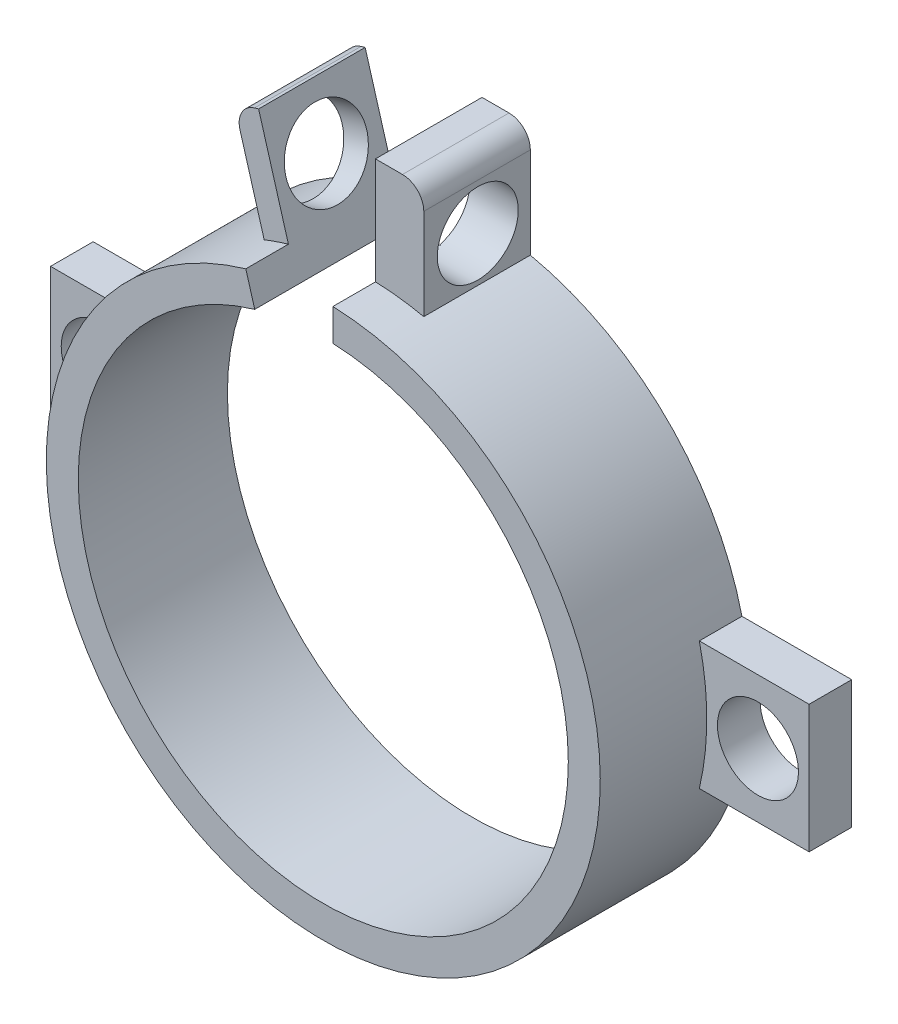
ISO-10303-21;
HEADER;
FILE_DESCRIPTION(('STEP AP214'),'2;1');
FILE_NAME('part.step','',(''),(''),'','','');
FILE_SCHEMA(('AUTOMOTIVE_DESIGN { 1 0 10303 214 1 1 1 1 }'));
ENDSEC;
DATA;
#1=APPLICATION_CONTEXT('core data for automotive mechanical design processes');
#2=APPLICATION_PROTOCOL_DEFINITION('international standard','automotive_design',2000,#1);
#3=PRODUCT_CONTEXT('',#1,'mechanical');
#4=PRODUCT('Part','Part','',(#3));
#5=PRODUCT_RELATED_PRODUCT_CATEGORY('part','',(#4));
#6=PRODUCT_DEFINITION_FORMATION('','',#4);
#7=PRODUCT_DEFINITION_CONTEXT('part definition',#1,'design');
#8=PRODUCT_DEFINITION('design','',#6,#7);
#9=PRODUCT_DEFINITION_SHAPE('','',#8);
#10=(LENGTH_UNIT() NAMED_UNIT(*) SI_UNIT(.MILLI.,.METRE.));
#11=(NAMED_UNIT(*) PLANE_ANGLE_UNIT() SI_UNIT($,.RADIAN.));
#12=(NAMED_UNIT(*) SI_UNIT($,.STERADIAN.) SOLID_ANGLE_UNIT());
#13=UNCERTAINTY_MEASURE_WITH_UNIT(LENGTH_MEASURE(1.E-05),#10,'distance_accuracy_value','');
#14=(GEOMETRIC_REPRESENTATION_CONTEXT(3) GLOBAL_UNCERTAINTY_ASSIGNED_CONTEXT((#13)) GLOBAL_UNIT_ASSIGNED_CONTEXT((#10,
#11,#12)) REPRESENTATION_CONTEXT('',''));
#15=CARTESIAN_POINT('',(0.,0.,0.));
#16=DIRECTION('',(0.,0.,1.));
#17=DIRECTION('',(1.,0.,0.));
#18=AXIS2_PLACEMENT_3D('',#15,#16,#17);
#19=CARTESIAN_POINT('',(0.,0.,-7.));
#20=DIRECTION('',(0.,0.,1.));
#21=DIRECTION('',(1.,0.,0.));
#22=AXIS2_PLACEMENT_3D('',#19,#20,#21);
#23=CYLINDRICAL_SURFACE('',#22,13.);
#24=CARTESIAN_POINT('',(0.,0.,-2.));
#25=DIRECTION('',(0.,0.,-1.));
#26=DIRECTION('',(-1.,0.,0.));
#27=AXIS2_PLACEMENT_3D('',#24,#25,#26);
#28=CIRCLE('',#27,13.);
#29=CARTESIAN_POINT('',(-4.77288630332188,12.0921278663254,-2.));
#30=VERTEX_POINT('',#29);
#31=CARTESIAN_POINT('',(-3.63631219376138,12.4810750189838,-2.));
#32=VERTEX_POINT('',#31);
#33=EDGE_CURVE('E71',#30,#32,#28,.T.);
#34=ORIENTED_EDGE('',*,*,#33,.F.);
#35=DIRECTION('',(0.,0.,-1.));
#36=VECTOR('',#35,1.);
#37=CARTESIAN_POINT('',(-4.77288630332188,12.0921278663254,-2.));
#38=LINE('',#37,#36);
#39=CARTESIAN_POINT('',(-4.77288630332188,12.0921278663254,-7.));
#40=VERTEX_POINT('',#39);
#41=EDGE_CURVE('E241',#30,#40,#38,.T.);
#42=ORIENTED_EDGE('',*,*,#41,.T.);
#43=CARTESIAN_POINT('',(0.,0.,-7.));
#44=DIRECTION('',(0.,0.,1.));
#45=DIRECTION('',(1.,0.,0.));
#46=AXIS2_PLACEMENT_3D('',#43,#44,#45);
#47=CIRCLE('',#46,13.);
#48=CARTESIAN_POINT('',(-12.6491106406735,2.99999999999991,-7.));
#49=VERTEX_POINT('',#48);
#50=EDGE_CURVE('E471',#40,#49,#47,.T.);
#51=ORIENTED_EDGE('',*,*,#50,.T.);
#52=DIRECTION('',(0.,0.,-1.));
#53=VECTOR('',#52,1.);
#54=CARTESIAN_POINT('',(-12.6491106406735,2.99999999999991,-5.));
#55=LINE('',#54,#53);
#56=CARTESIAN_POINT('',(-12.6491106406735,2.99999999999991,-5.));
#57=VERTEX_POINT('',#56);
#58=EDGE_CURVE('E450',#57,#49,#55,.T.);
#59=ORIENTED_EDGE('',*,*,#58,.F.);
#60=CARTESIAN_POINT('',(0.,0.,-5.));
#61=DIRECTION('',(0.,0.,-1.));
#62=DIRECTION('',(-1.,0.,0.));
#63=AXIS2_PLACEMENT_3D('',#60,#61,#62);
#64=CIRCLE('',#63,13.);
#65=CARTESIAN_POINT('',(-12.6491106406735,-3.00000000000009,-5.));
#66=VERTEX_POINT('',#65);
#67=EDGE_CURVE('E437',#66,#57,#64,.T.);
#68=ORIENTED_EDGE('',*,*,#67,.F.);
#69=DIRECTION('',(0.,0.,-1.));
#70=VECTOR('',#69,1.);
#71=CARTESIAN_POINT('',(-12.6491106406735,-3.00000000000009,-5.));
#72=LINE('',#71,#70);
#73=CARTESIAN_POINT('',(-12.6491106406735,-3.00000000000009,-7.));
#74=VERTEX_POINT('',#73);
#75=EDGE_CURVE('E466',#66,#74,#72,.T.);
#76=ORIENTED_EDGE('',*,*,#75,.T.);
#77=CARTESIAN_POINT('',(12.6491106406735,-3.,-7.));
#78=VERTEX_POINT('',#77);
#79=EDGE_CURVE('E474',#74,#78,#47,.T.);
#80=ORIENTED_EDGE('',*,*,#79,.T.);
#81=DIRECTION('',(0.,0.,-1.));
#82=VECTOR('',#81,1.);
#83=CARTESIAN_POINT('',(12.6491106406735,-3.,-5.));
#84=LINE('',#83,#82);
#85=CARTESIAN_POINT('',(12.6491106406735,-3.,-5.));
#86=VERTEX_POINT('',#85);
#87=EDGE_CURVE('E410',#86,#78,#84,.T.);
#88=ORIENTED_EDGE('',*,*,#87,.F.);
#89=CARTESIAN_POINT('',(0.,0.,-5.));
#90=DIRECTION('',(0.,0.,-1.));
#91=DIRECTION('',(-1.,0.,0.));
#92=AXIS2_PLACEMENT_3D('',#89,#90,#91);
#93=CIRCLE('',#92,13.);
#94=CARTESIAN_POINT('',(12.6491106406735,3.,-5.));
#95=VERTEX_POINT('',#94);
#96=EDGE_CURVE('E402',#95,#86,#93,.T.);
#97=ORIENTED_EDGE('',*,*,#96,.F.);
#98=DIRECTION('',(0.,0.,-1.));
#99=VECTOR('',#98,1.);
#100=CARTESIAN_POINT('',(12.6491106406735,3.,-5.));
#101=LINE('',#100,#99);
#102=CARTESIAN_POINT('',(12.6491106406735,3.,-7.));
#103=VERTEX_POINT('',#102);
#104=EDGE_CURVE('E429',#95,#103,#101,.T.);
#105=ORIENTED_EDGE('',*,*,#104,.T.);
#106=CARTESIAN_POINT('',(2.7175174746219,12.7127927213152,-7.));
#107=VERTEX_POINT('',#106);
#108=EDGE_CURVE('E545',#103,#107,#47,.T.);
#109=ORIENTED_EDGE('',*,*,#108,.T.);
#110=DIRECTION('',(0.,0.,-1.));
#111=VECTOR('',#110,1.);
#112=CARTESIAN_POINT('',(2.7175174746219,12.7127927213152,-2.));
#113=LINE('',#112,#111);
#114=CARTESIAN_POINT('',(2.7175174746219,12.7127927213152,-2.));
#115=VERTEX_POINT('',#114);
#116=EDGE_CURVE('E380',#115,#107,#113,.T.);
#117=ORIENTED_EDGE('',*,*,#116,.F.);
#118=CARTESIAN_POINT('',(0.,0.,-2.));
#119=DIRECTION('',(0.,0.,-1.));
#120=DIRECTION('',(-1.,0.,0.));
#121=AXIS2_PLACEMENT_3D('',#118,#119,#120);
#122=CIRCLE('',#121,13.);
#123=CARTESIAN_POINT('',(0.595067388336295,12.9863734276871,-2.));
#124=VERTEX_POINT('',#123);
#125=EDGE_CURVE('E589',#124,#115,#122,.T.);
#126=ORIENTED_EDGE('',*,*,#125,.F.);
#127=DIRECTION('',(0.,0.,-1.));
#128=VECTOR('',#127,1.);
#129=CARTESIAN_POINT('',(0.595067388336296,12.9863734276871,-2.));
#130=LINE('',#129,#128);
#131=CARTESIAN_POINT('',(0.595067388336296,12.9863734276871,-4.07773920789325));
#132=VERTEX_POINT('',#131);
#133=EDGE_CURVE('E379',#124,#132,#130,.T.);
#134=ORIENTED_EDGE('',*,*,#133,.T.);
#135=CARTESIAN_POINT('',(0.449573557955294,12.9922239672809,-4.05470401112014));
#136=CARTESIAN_POINT('',(0.488859370004037,12.9908652955899,-4.05993242301531));
#137=CARTESIAN_POINT('',(0.528050965217172,12.9893300069907,-4.06589927704823));
#138=CARTESIAN_POINT('',(0.606193702039485,12.9859176149584,-4.07952709326514));
#139=CARTESIAN_POINT('',(0.645144293468684,12.9840399097325,-4.08719104323699));
#140=CARTESIAN_POINT('',(0.722847449837045,12.9799466612317,-4.10446536918196));
#141=CARTESIAN_POINT('',(0.761597383909745,12.9777291394168,-4.11408726021047));
#142=CARTESIAN_POINT('',(0.838430293481071,12.9729916874695,-4.13557120541122));
#143=CARTESIAN_POINT('',(0.876513767982155,12.9704719957503,-4.14743149766109));
#144=CARTESIAN_POINT('',(0.949163938022189,12.9653508630974,-4.17299041123941));
#145=CARTESIAN_POINT('',(0.983794112806286,12.9627665202925,-4.18651009451632));
#146=CARTESIAN_POINT('',(1.05178900580302,12.9574264064672,-4.21655557337149));
#147=CARTESIAN_POINT('',(1.08515268545299,12.9546704994473,-4.23308377430113));
#148=CARTESIAN_POINT('',(1.1438562685919,12.9496062054699,-4.26678713589666));
#149=CARTESIAN_POINT('',(1.16956336438751,12.9473060224086,-4.2833168136377));
#150=CARTESIAN_POINT('',(1.21837393057572,12.9428032002544,-4.31985404596173));
#151=CARTESIAN_POINT('',(1.24148847591711,12.9406001727089,-4.33984579989901));
#152=CARTESIAN_POINT('',(1.2720598885534,12.9376182087695,-4.37270530455639));
#153=CARTESIAN_POINT('',(1.28137493859821,12.9366979203703,-4.38381719497882));
#154=CARTESIAN_POINT('',(1.29849740149479,12.9349904418109,-4.40718800859379));
#155=CARTESIAN_POINT('',(1.3063041941194,12.9342033064224,-4.41944740059989));
#156=CARTESIAN_POINT('',(1.31994020357078,12.9328189494738,-4.44529059986966));
#157=CARTESIAN_POINT('',(1.3257390342871,12.9322246539049,-4.45889106432313));
#158=CARTESIAN_POINT('',(1.33450025546858,12.9313235738463,-4.48697926869783));
#159=CARTESIAN_POINT('',(1.33747081807351,12.9310159610559,-4.5014643227841));
#160=CARTESIAN_POINT('',(1.33993662752472,12.9307606496406,-4.52864539108484));
#161=CARTESIAN_POINT('',(1.33986742856083,12.9307678431495,-4.5413016334258));
#162=CARTESIAN_POINT('',(1.33733098863737,12.9310304054296,-4.56637258567058));
#163=CARTESIAN_POINT('',(1.33486170960086,12.9312859851231,-4.57878708115058));
#164=CARTESIAN_POINT('',(1.32743283899102,12.9320507636919,-4.60429650191897));
#165=CARTESIAN_POINT('',(1.32223181741911,12.9325845019224,-4.61731879782247));
#166=CARTESIAN_POINT('',(1.30980817948185,12.9338486780719,-4.64234058813223));
#167=CARTESIAN_POINT('',(1.30258249248203,12.934579414697,-4.65433849258822));
#168=CARTESIAN_POINT('',(1.28202950466573,12.9366362589828,-4.68391008310571));
#169=CARTESIAN_POINT('',(1.2675903003093,12.9380622703417,-4.70069516005044));
#170=CARTESIAN_POINT('',(1.23643172744966,12.9410774701532,-4.73195525671972));
#171=CARTESIAN_POINT('',(1.21970623026688,12.9426670942591,-4.74642383240245));
#172=CARTESIAN_POINT('',(1.16724373629715,12.9475388819386,-4.78712305802338));
#173=CARTESIAN_POINT('',(1.12933703684351,12.9509119949392,-4.81050921917742));
#174=CARTESIAN_POINT('',(1.05070880384488,12.9575306541135,-4.85223435347826));
#175=CARTESIAN_POINT('',(1.00997034599407,12.9607752115905,-4.87053900199822));
#176=CARTESIAN_POINT('',(0.926368132662709,12.9670205603693,-4.90356611244339));
#177=CARTESIAN_POINT('',(0.883481953504802,12.9700170726806,-4.91823202746056));
#178=CARTESIAN_POINT('',(0.796716207657195,12.9756364005753,-4.94449717064017));
#179=CARTESIAN_POINT('',(0.75283534729615,12.9782586927993,-4.95609212297143));
#180=CARTESIAN_POINT('',(0.665858749093949,12.9830068601549,-4.97640666929917));
#181=CARTESIAN_POINT('',(0.622781916761244,12.98514578651,-4.98520543597086));
#182=CARTESIAN_POINT('',(0.536364002167003,12.9890025288228,-5.00068232700251));
#183=CARTESIAN_POINT('',(0.493024131466979,12.9907216130431,-5.0073668565834));
#184=CARTESIAN_POINT('',(0.449573557955295,12.9922239672809,-5.01315522713724));
#185=B_SPLINE_CURVE_WITH_KNOTS('',3,(#135,#136,#137,#138,#139,#140,#141,#142,#143,#144,#145,
#146,#147,#148,#149,#150,#151,#152,#153,#154,#155,#156,#157,#158,#159,#160,#161,#162,#163,#164,
#165,#166,#167,#168,#169,#170,#171,#172,#173,#174,#175,#176,#177,#178,#179,#180,#181,#182,#183,
#184),.UNSPECIFIED.,.F.,.F.,(4,2,2,2,2,2,2,2,2,2,2,2,2,2,2,2,2,2,2,2,2,2,2,2,4),(0.,
0.118974083112916,0.238159312879793,0.358066879836008,0.477880454131258,0.589578335914206,
0.701365917115455,0.793141868623215,0.884509499053711,0.928003252276417,0.97151485315211,
1.01565875174486,1.05967470813972,1.0974076264977,1.13517261455118,1.17704090274683,
1.21897303586617,1.28515762158955,1.35152323535834,1.48478409433956,1.61892433776473,
1.75503427159676,1.89133273246481,2.02333118261898,2.15492581691757),.UNSPECIFIED.);
#186=CARTESIAN_POINT('',(0.449573557955288,12.9922239672809,-4.0547040111201));
#187=VERTEX_POINT('',#186);
#188=EDGE_CURVE('E261',#187,#132,#185,.T.);
#189=ORIENTED_EDGE('',*,*,#188,.F.);
#190=DIRECTION('',(0.,0.,1.));
#191=VECTOR('',#190,1.);
#192=CARTESIAN_POINT('',(0.449573557955288,12.9922239672809,-7.));
#193=LINE('',#192,#191);
#194=CARTESIAN_POINT('',(0.449573557955288,12.9922239672809,0.));
#195=VERTEX_POINT('',#194);
#196=EDGE_CURVE('E483',#187,#195,#193,.T.);
#197=ORIENTED_EDGE('',*,*,#196,.T.);
#198=CARTESIAN_POINT('',(0.,0.,0.));
#199=DIRECTION('',(0.,0.,1.));
#200=DIRECTION('',(1.,0.,0.));
#201=AXIS2_PLACEMENT_3D('',#198,#199,#200);
#202=CIRCLE('',#201,13.);
#203=CARTESIAN_POINT('',(-3.63631219376138,12.4810750189838,0.));
#204=VERTEX_POINT('',#203);
#205=EDGE_CURVE('E463',#204,#195,#202,.T.);
#206=ORIENTED_EDGE('',*,*,#205,.F.);
#207=DIRECTION('',(0.,0.,1.));
#208=VECTOR('',#207,1.);
#209=CARTESIAN_POINT('',(-3.63631219376138,12.4810750189838,-7.));
#210=LINE('',#209,#208);
#211=EDGE_CURVE('E58',#32,#204,#210,.T.);
#212=ORIENTED_EDGE('',*,*,#211,.F.);
#213=EDGE_LOOP('',(#34,#42,#51,#59,#68,#76,#80,#88,#97,#105,#109,#117,#126,#134,#189,#197,#206,#212));
#214=FACE_BOUND('',#213,.T.);
#215=ADVANCED_FACE('F49',(#214),#23,.T.);
#216=CARTESIAN_POINT('',(0.595067388336296,12.9863734276871,-2.));
#217=DIRECTION('',(-0.0457744144874074,-0.99895180212978,0.));
#218=DIRECTION('',(0.99895180212978,-0.0457744144874074,0.));
#219=AXIS2_PLACEMENT_3D('',#216,#217,#218);
#220=PLANE('',#219);
#221=CARTESIAN_POINT('',(-39.6564159827522,14.8307948298338,-4.53392961912868));
#222=DIRECTION('',(-0.0457744144874074,-0.99895180212978,0.));
#223=DIRECTION('',(0.99895180212978,-0.0457744144874074,0.));
#224=AXIS2_PLACEMENT_3D('',#221,#222,#223);
#225=ELLIPSE('',#224,41.5079039519488,1.9);
#226=CARTESIAN_POINT('',(0.449573557955288,12.993040310797,-4.05158293078121));
#227=VERTEX_POINT('',#226);
#228=EDGE_CURVE('E252',#132,#227,#225,.T.);
#229=ORIENTED_EDGE('',*,*,#228,.F.);
#230=ORIENTED_EDGE('',*,*,#133,.F.);
#231=DIRECTION('',(-0.99895180212978,0.0457744144874074,0.));
#232=VECTOR('',#231,1.);
#233=CARTESIAN_POINT('',(0.595067388336296,12.9863734276871,-2.));
#234=LINE('',#233,#232);
#235=CARTESIAN_POINT('',(0.449573557955288,12.993040310797,-2.));
#236=VERTEX_POINT('',#235);
#237=EDGE_CURVE('E587',#124,#236,#234,.T.);
#238=ORIENTED_EDGE('',*,*,#237,.T.);
#239=DIRECTION('',(0.,0.,-1.));
#240=VECTOR('',#239,1.);
#241=CARTESIAN_POINT('',(0.449573557955288,12.993040310797,-2.));
#242=LINE('',#241,#240);
#243=EDGE_CURVE('E388',#236,#227,#242,.T.);
#244=ORIENTED_EDGE('',*,*,#243,.T.);
#245=EDGE_LOOP('',(#229,#230,#238,#244));
#246=FACE_BOUND('',#245,.T.);
#247=ADVANCED_FACE('F287',(#246),#220,.T.);
#248=CARTESIAN_POINT('',(0.595067388336296,12.9863734276871,-4.99012003036412));
#249=VERTEX_POINT('',#248);
#250=CARTESIAN_POINT('',(0.449573557955294,12.9922239672809,-5.01315522713723));
#251=VERTEX_POINT('',#250);
#252=EDGE_CURVE('E254',#249,#251,#185,.T.);
#253=ORIENTED_EDGE('',*,*,#252,.F.);
#254=CARTESIAN_POINT('',(0.595067388336296,12.9863734276871,-7.));
#255=VERTEX_POINT('',#254);
#256=EDGE_CURVE('E370',#249,#255,#130,.T.);
#257=ORIENTED_EDGE('',*,*,#256,.T.);
#258=CARTESIAN_POINT('',(0.449573557955288,12.9922239672809,-7.));
#259=VERTEX_POINT('',#258);
#260=EDGE_CURVE('E475',#255,#259,#47,.T.);
#261=ORIENTED_EDGE('',*,*,#260,.T.);
#262=EDGE_CURVE('E373',#259,#251,#193,.T.);
#263=ORIENTED_EDGE('',*,*,#262,.T.);
#264=EDGE_LOOP('',(#253,#257,#261,#263));
#265=FACE_BOUND('',#264,.T.);
#266=ADVANCED_FACE('F51',(#265),#23,.T.);
#267=CARTESIAN_POINT('',(-3.63631219376138,12.4810750189838,-7.));
#268=DIRECTION('',(0.960082693767985,0.279716322597037,0.));
#269=DIRECTION('',(-0.279716322597037,0.960082693767985,0.));
#270=AXIS2_PLACEMENT_3D('',#267,#268,#269);
#271=PLANE('',#270);
#272=CARTESIAN_POINT('',(-4.26906681528091,14.6529066657118,-4.412219035828));
#273=DIRECTION('',(0.960082693767985,0.279716322597037,0.));
#274=DIRECTION('',(-0.279716322597037,0.960082693767985,0.));
#275=AXIS2_PLACEMENT_3D('',#272,#273,#274);
#276=CIRCLE('',#275,1.9);
#277=CARTESIAN_POINT('',(-4.80052782821528,16.4770637838709,-4.412219035828));
#278=VERTEX_POINT('',#277);
#279=EDGE_CURVE('E231',#278,#278,#276,.T.);
#280=ORIENTED_EDGE('',*,*,#279,.F.);
#281=EDGE_LOOP('',(#280));
#282=FACE_BOUND('',#281,.T.);
#283=DIRECTION('',(-0.279716322597037,0.960082693767985,0.));
#284=VECTOR('',#283,1.);
#285=CARTESIAN_POINT('',(-3.63631219376138,12.4810750189838,0.));
#286=LINE('',#285,#284);
#287=CARTESIAN_POINT('',(-3.21673770986583,11.0409509783319,0.));
#288=VERTEX_POINT('',#287);
#289=EDGE_CURVE('E492',#288,#204,#286,.T.);
#290=ORIENTED_EDGE('',*,*,#289,.F.);
#291=DIRECTION('',(0.,0.,1.));
#292=VECTOR('',#291,1.);
#293=CARTESIAN_POINT('',(-3.21673770986583,11.0409509783319,-7.));
#294=LINE('',#293,#292);
#295=CARTESIAN_POINT('',(-3.21673770986583,11.0409509783319,-7.));
#296=VERTEX_POINT('',#295);
#297=EDGE_CURVE('E496',#296,#288,#294,.T.);
#298=ORIENTED_EDGE('',*,*,#297,.F.);
#299=DIRECTION('',(-0.279716322597037,0.960082693767985,0.));
#300=VECTOR('',#299,1.);
#301=CARTESIAN_POINT('',(-3.63631219376138,12.4810750189838,-7.));
#302=LINE('',#301,#300);
#303=CARTESIAN_POINT('',(-5.03489380674667,17.2814884878237,-7.));
#304=VERTEX_POINT('',#303);
#305=EDGE_CURVE('E481',#296,#304,#302,.T.);
#306=ORIENTED_EDGE('',*,*,#305,.T.);
#307=DIRECTION('',(0.,0.,-1.));
#308=VECTOR('',#307,1.);
#309=CARTESIAN_POINT('',(-5.03489380674667,17.2814884878237,-2.));
#310=LINE('',#309,#308);
#311=CARTESIAN_POINT('',(-5.03489380674667,17.2814884878237,-2.));
#312=VERTEX_POINT('',#311);
#313=EDGE_CURVE('E239',#312,#304,#310,.T.);
#314=ORIENTED_EDGE('',*,*,#313,.F.);
#315=DIRECTION('',(-0.279716322597037,0.960082693767985,0.));
#316=VECTOR('',#315,1.);
#317=CARTESIAN_POINT('',(0.,0.,-2.));
#318=LINE('',#317,#316);
#319=EDGE_CURVE('E509',#32,#312,#318,.T.);
#320=ORIENTED_EDGE('',*,*,#319,.F.);
#321=ORIENTED_EDGE('',*,*,#211,.T.);
#322=EDGE_LOOP('',(#290,#298,#306,#314,#320,#321));
#323=FACE_BOUND('',#322,.T.);
#324=ADVANCED_FACE('F346',(#282,#323),#271,.T.);
#325=CARTESIAN_POINT('',(0.,0.,-7.));
#326=DIRECTION('',(0.,0.,1.));
#327=DIRECTION('',(1.,0.,0.));
#328=AXIS2_PLACEMENT_3D('',#325,#326,#327);
#329=CYLINDRICAL_SURFACE('',#328,11.5);
#330=CARTESIAN_POINT('',(0.,0.,0.));
#331=DIRECTION('',(0.,0.,-1.));
#332=DIRECTION('',(1.,0.,0.));
#333=AXIS2_PLACEMENT_3D('',#330,#331,#332);
#334=CIRCLE('',#333,11.5);
#335=CARTESIAN_POINT('',(0.449573557955286,11.4912089710347,0.));
#336=VERTEX_POINT('',#335);
#337=EDGE_CURVE('E489',#336,#288,#334,.T.);
#338=ORIENTED_EDGE('',*,*,#337,.F.);
#339=DIRECTION('',(0.,0.,1.));
#340=VECTOR('',#339,1.);
#341=CARTESIAN_POINT('',(0.449573557955286,11.4912089710347,-7.));
#342=LINE('',#341,#340);
#343=CARTESIAN_POINT('',(0.449573557955286,11.4912089710347,-7.));
#344=VERTEX_POINT('',#343);
#345=EDGE_CURVE('E498',#344,#336,#342,.T.);
#346=ORIENTED_EDGE('',*,*,#345,.F.);
#347=CARTESIAN_POINT('',(0.,0.,-7.));
#348=DIRECTION('',(0.,0.,-1.));
#349=DIRECTION('',(1.,0.,0.));
#350=AXIS2_PLACEMENT_3D('',#347,#348,#349);
#351=CIRCLE('',#350,11.5);
#352=EDGE_CURVE('E478',#344,#296,#351,.T.);
#353=ORIENTED_EDGE('',*,*,#352,.T.);
#354=ORIENTED_EDGE('',*,*,#297,.T.);
#355=EDGE_LOOP('',(#338,#346,#353,#354));
#356=FACE_BOUND('',#355,.T.);
#357=ADVANCED_FACE('F349',(#356),#329,.F.);
#358=CARTESIAN_POINT('',(0.449573557955288,12.9922239672809,-7.));
#359=DIRECTION('',(-1.,0.,0.));
#360=DIRECTION('',(0.,-1.,0.));
#361=AXIS2_PLACEMENT_3D('',#358,#359,#360);
#362=PLANE('',#361);
#363=CARTESIAN_POINT('',(0.449573557955288,14.8307948298338,-4.53392961912868));
#364=DIRECTION('',(-1.,0.,0.));
#365=DIRECTION('',(0.,-1.,0.));
#366=AXIS2_PLACEMENT_3D('',#363,#364,#365);
#367=CIRCLE('',#366,1.9);
#368=EDGE_CURVE('E262',#251,#187,#367,.T.);
#369=ORIENTED_EDGE('',*,*,#368,.F.);
#370=ORIENTED_EDGE('',*,*,#262,.F.);
#371=DIRECTION('',(0.,-1.,0.));
#372=VECTOR('',#371,1.);
#373=CARTESIAN_POINT('',(0.449573557955288,12.9922239672809,-7.));
#374=LINE('',#373,#372);
#375=EDGE_CURVE('E473',#259,#344,#374,.T.);
#376=ORIENTED_EDGE('',*,*,#375,.T.);
#377=ORIENTED_EDGE('',*,*,#345,.T.);
#378=DIRECTION('',(0.,-1.,0.));
#379=VECTOR('',#378,1.);
#380=CARTESIAN_POINT('',(0.449573557955288,12.9922239672809,0.));
#381=LINE('',#380,#379);
#382=EDGE_CURVE('E486',#195,#336,#381,.T.);
#383=ORIENTED_EDGE('',*,*,#382,.F.);
#384=ORIENTED_EDGE('',*,*,#196,.F.);
#385=EDGE_LOOP('',(#369,#370,#376,#377,#383,#384));
#386=FACE_BOUND('',#385,.T.);
#387=ADVANCED_FACE('F341',(#386),#362,.T.);
#388=CARTESIAN_POINT('',(0.,0.,-7.));
#389=DIRECTION('',(0.,0.,1.));
#390=DIRECTION('',(1.,0.,0.));
#391=AXIS2_PLACEMENT_3D('',#388,#389,#390);
#392=PLANE('',#391);
#393=ORIENTED_EDGE('',*,*,#50,.F.);
#394=DIRECTION('',(0.279716322597037,-0.960082693767985,0.));
#395=VECTOR('',#394,1.);
#396=CARTESIAN_POINT('',(-1.15209923252148,-0.335659587116416,-7.));
#397=LINE('',#396,#395);
#398=CARTESIAN_POINT('',(-5.90727671667111,15.9857462069393,-7.));
#399=VERTEX_POINT('',#398);
#400=EDGE_CURVE('E521',#399,#40,#397,.T.);
#401=ORIENTED_EDGE('',*,*,#400,.F.);
#402=CARTESIAN_POINT('',(-4.94719402290313,16.2654625295363,-7.));
#403=DIRECTION('',(0.,0.,-1.));
#404=DIRECTION('',(-1.,0.,0.));
#405=AXIS2_PLACEMENT_3D('',#402,#403,#404);
#406=CIRCLE('',#405,1.);
#407=CARTESIAN_POINT('',(-5.22691034550017,17.2255452233043,-7.));
#408=VERTEX_POINT('',#407);
#409=EDGE_CURVE('E524',#399,#408,#406,.T.);
#410=ORIENTED_EDGE('',*,*,#409,.T.);
#411=DIRECTION('',(-0.960082693767988,-0.279716322597028,0.));
#412=VECTOR('',#411,1.);
#413=CARTESIAN_POINT('',(-5.03489380674649,17.2814884878238,-7.));
#414=LINE('',#413,#412);
#415=EDGE_CURVE('E515',#304,#408,#414,.T.);
#416=ORIENTED_EDGE('',*,*,#415,.F.);
#417=ORIENTED_EDGE('',*,*,#305,.F.);
#418=ORIENTED_EDGE('',*,*,#352,.F.);
#419=ORIENTED_EDGE('',*,*,#375,.F.);
#420=ORIENTED_EDGE('',*,*,#260,.F.);
#421=DIRECTION('',(-0.99895180212978,0.0457744144874074,0.));
#422=VECTOR('',#421,1.);
#423=CARTESIAN_POINT('',(0.595067388336296,12.9863734276871,-7.));
#424=LINE('',#423,#422);
#425=CARTESIAN_POINT('',(0.449573557955288,12.993040310797,-7.));
#426=VERTEX_POINT('',#425);
#427=EDGE_CURVE('E378',#255,#426,#424,.T.);
#428=ORIENTED_EDGE('',*,*,#427,.T.);
#429=DIRECTION('',(0.,1.,0.));
#430=VECTOR('',#429,1.);
#431=CARTESIAN_POINT('',(0.449573557955288,0.,-7.));
#432=LINE('',#431,#430);
#433=CARTESIAN_POINT('',(0.449573557955288,17.9922239672809,-7.));
#434=VERTEX_POINT('',#433);
#435=EDGE_CURVE('E566',#426,#434,#432,.T.);
#436=ORIENTED_EDGE('',*,*,#435,.T.);
#437=DIRECTION('',(-1.,0.,0.));
#438=VECTOR('',#437,1.);
#439=CARTESIAN_POINT('',(0.,17.9922239672809,-7.));
#440=LINE('',#439,#438);
#441=CARTESIAN_POINT('',(1.7175174746219,17.9922239672809,-7.));
#442=VERTEX_POINT('',#441);
#443=EDGE_CURVE('E568',#442,#434,#440,.T.);
#444=ORIENTED_EDGE('',*,*,#443,.F.);
#445=CARTESIAN_POINT('',(1.7175174746219,16.9922239672809,-7.));
#446=DIRECTION('',(0.,0.,-1.));
#447=DIRECTION('',(-1.,0.,0.));
#448=AXIS2_PLACEMENT_3D('',#445,#446,#447);
#449=CIRCLE('',#448,1.);
#450=CARTESIAN_POINT('',(2.7175174746219,16.9922239672809,-7.));
#451=VERTEX_POINT('',#450);
#452=EDGE_CURVE('E564',#442,#451,#449,.T.);
#453=ORIENTED_EDGE('',*,*,#452,.T.);
#454=DIRECTION('',(0.,1.,0.));
#455=VECTOR('',#454,1.);
#456=CARTESIAN_POINT('',(2.7175174746219,0.,-7.));
#457=LINE('',#456,#455);
#458=EDGE_CURVE('E559',#107,#451,#457,.T.);
#459=ORIENTED_EDGE('',*,*,#458,.F.);
#460=ORIENTED_EDGE('',*,*,#108,.F.);
#461=DIRECTION('',(-1.,0.,0.));
#462=VECTOR('',#461,1.);
#463=CARTESIAN_POINT('',(0.,3.,-7.));
#464=LINE('',#463,#462);
#465=CARTESIAN_POINT('',(17.8,3.,-7.));
#466=VERTEX_POINT('',#465);
#467=EDGE_CURVE('E418',#466,#103,#464,.T.);
#468=ORIENTED_EDGE('',*,*,#467,.F.);
#469=DIRECTION('',(0.,1.,0.));
#470=VECTOR('',#469,1.);
#471=CARTESIAN_POINT('',(17.8,0.,-7.));
#472=LINE('',#471,#470);
#473=CARTESIAN_POINT('',(17.8,-3.,-7.));
#474=VERTEX_POINT('',#473);
#475=EDGE_CURVE('E399',#474,#466,#472,.T.);
#476=ORIENTED_EDGE('',*,*,#475,.F.);
#477=DIRECTION('',(1.,0.,0.));
#478=VECTOR('',#477,1.);
#479=CARTESIAN_POINT('',(0.,-3.,-7.));
#480=LINE('',#479,#478);
#481=EDGE_CURVE('E414',#78,#474,#480,.T.);
#482=ORIENTED_EDGE('',*,*,#481,.F.);
#483=ORIENTED_EDGE('',*,*,#79,.F.);
#484=DIRECTION('',(-1.,0.,0.));
#485=VECTOR('',#484,1.);
#486=CARTESIAN_POINT('',(0.,-3.,-7.));
#487=LINE('',#486,#485);
#488=CARTESIAN_POINT('',(-17.8,-3.00000000000012,-7.));
#489=VERTEX_POINT('',#488);
#490=EDGE_CURVE('E453',#74,#489,#487,.T.);
#491=ORIENTED_EDGE('',*,*,#490,.T.);
#492=DIRECTION('',(0.,1.,0.));
#493=VECTOR('',#492,1.);
#494=CARTESIAN_POINT('',(-17.8,-1.23512311489549E-13,-7.));
#495=LINE('',#494,#493);
#496=CARTESIAN_POINT('',(-17.8,2.99999999999988,-7.));
#497=VERTEX_POINT('',#496);
#498=EDGE_CURVE('E456',#489,#497,#495,.T.);
#499=ORIENTED_EDGE('',*,*,#498,.T.);
#500=DIRECTION('',(1.,0.,0.));
#501=VECTOR('',#500,1.);
#502=CARTESIAN_POINT('',(0.,3.,-7.));
#503=LINE('',#502,#501);
#504=EDGE_CURVE('E425',#497,#49,#503,.T.);
#505=ORIENTED_EDGE('',*,*,#504,.T.);
#506=EDGE_LOOP('',(#393,#401,#410,#416,#417,#418,#419,#420,#428,#436,#444,#453,#459,#460,#468,
#476,#482,#483,#491,#499,#505));
#507=FACE_BOUND('',#506,.T.);
#508=CARTESIAN_POINT('',(-15.4,-1.03946450342397E-13,-7.));
#509=DIRECTION('',(0.,0.,-1.));
#510=DIRECTION('',(-1.,0.,0.));
#511=AXIS2_PLACEMENT_3D('',#508,#509,#510);
#512=CIRCLE('',#511,1.9);
#513=CARTESIAN_POINT('',(-17.3,-1.03946450342397E-13,-7.));
#514=VERTEX_POINT('',#513);
#515=EDGE_CURVE('E438',#514,#514,#512,.F.);
#516=ORIENTED_EDGE('',*,*,#515,.T.);
#517=EDGE_LOOP('',(#516));
#518=FACE_BOUND('',#517,.T.);
#519=CARTESIAN_POINT('',(15.4,0.,-7.));
#520=DIRECTION('',(0.,0.,-1.));
#521=DIRECTION('',(-1.,0.,0.));
#522=AXIS2_PLACEMENT_3D('',#519,#520,#521);
#523=CIRCLE('',#522,1.9);
#524=CARTESIAN_POINT('',(13.5,0.,-7.));
#525=VERTEX_POINT('',#524);
#526=EDGE_CURVE('E411',#525,#525,#523,.T.);
#527=ORIENTED_EDGE('',*,*,#526,.F.);
#528=EDGE_LOOP('',(#527));
#529=FACE_BOUND('',#528,.T.);
#530=ADVANCED_FACE('F338',(#507,#518,#529),#392,.F.);
#531=CARTESIAN_POINT('',(0.,0.,0.));
#532=DIRECTION('',(0.,0.,1.));
#533=DIRECTION('',(1.,0.,0.));
#534=AXIS2_PLACEMENT_3D('',#531,#532,#533);
#535=PLANE('',#534);
#536=ORIENTED_EDGE('',*,*,#205,.T.);
#537=ORIENTED_EDGE('',*,*,#382,.T.);
#538=ORIENTED_EDGE('',*,*,#337,.T.);
#539=ORIENTED_EDGE('',*,*,#289,.T.);
#540=EDGE_LOOP('',(#536,#537,#538,#539));
#541=FACE_BOUND('',#540,.T.);
#542=ADVANCED_FACE('F336',(#541),#535,.T.);
#543=CARTESIAN_POINT('',(0.,3.,-5.));
#544=DIRECTION('',(0.,1.,0.));
#545=DIRECTION('',(-1.,0.,0.));
#546=AXIS2_PLACEMENT_3D('',#543,#544,#545);
#547=PLANE('',#546);
#548=ORIENTED_EDGE('',*,*,#504,.F.);
#549=DIRECTION('',(0.,0.,-1.));
#550=VECTOR('',#549,1.);
#551=CARTESIAN_POINT('',(-17.8,2.99999999999988,-5.));
#552=LINE('',#551,#550);
#553=CARTESIAN_POINT('',(-17.8,2.99999999999988,-5.));
#554=VERTEX_POINT('',#553);
#555=EDGE_CURVE('E461',#554,#497,#552,.T.);
#556=ORIENTED_EDGE('',*,*,#555,.F.);
#557=DIRECTION('',(1.,0.,0.));
#558=VECTOR('',#557,1.);
#559=CARTESIAN_POINT('',(0.,3.,-5.));
#560=LINE('',#559,#558);
#561=EDGE_CURVE('E434',#554,#57,#560,.T.);
#562=ORIENTED_EDGE('',*,*,#561,.T.);
#563=ORIENTED_EDGE('',*,*,#58,.T.);
#564=EDGE_LOOP('',(#548,#556,#562,#563));
#565=FACE_BOUND('',#564,.T.);
#566=ADVANCED_FACE('F329',(#565),#547,.T.);
#567=CARTESIAN_POINT('',(-17.8,-1.23512311489549E-13,-5.));
#568=DIRECTION('',(-1.,0.,0.));
#569=DIRECTION('',(0.,-1.,0.));
#570=AXIS2_PLACEMENT_3D('',#567,#568,#569);
#571=PLANE('',#570);
#572=ORIENTED_EDGE('',*,*,#498,.F.);
#573=DIRECTION('',(0.,0.,-1.));
#574=VECTOR('',#573,1.);
#575=CARTESIAN_POINT('',(-17.8,-3.00000000000012,-5.));
#576=LINE('',#575,#574);
#577=CARTESIAN_POINT('',(-17.8,-3.00000000000012,-5.));
#578=VERTEX_POINT('',#577);
#579=EDGE_CURVE('E464',#578,#489,#576,.T.);
#580=ORIENTED_EDGE('',*,*,#579,.F.);
#581=DIRECTION('',(0.,1.,0.));
#582=VECTOR('',#581,1.);
#583=CARTESIAN_POINT('',(-17.8,-1.23512311489549E-13,-5.));
#584=LINE('',#583,#582);
#585=EDGE_CURVE('E444',#578,#554,#584,.T.);
#586=ORIENTED_EDGE('',*,*,#585,.T.);
#587=ORIENTED_EDGE('',*,*,#555,.T.);
#588=EDGE_LOOP('',(#572,#580,#586,#587));
#589=FACE_BOUND('',#588,.T.);
#590=ADVANCED_FACE('F326',(#589),#571,.T.);
#591=CARTESIAN_POINT('',(0.,-3.,-5.));
#592=DIRECTION('',(0.,-1.,0.));
#593=DIRECTION('',(1.,0.,0.));
#594=AXIS2_PLACEMENT_3D('',#591,#592,#593);
#595=PLANE('',#594);
#596=ORIENTED_EDGE('',*,*,#490,.F.);
#597=ORIENTED_EDGE('',*,*,#75,.F.);
#598=DIRECTION('',(-1.,0.,0.));
#599=VECTOR('',#598,1.);
#600=CARTESIAN_POINT('',(0.,-3.,-5.));
#601=LINE('',#600,#599);
#602=EDGE_CURVE('E441',#66,#578,#601,.T.);
#603=ORIENTED_EDGE('',*,*,#602,.T.);
#604=ORIENTED_EDGE('',*,*,#579,.T.);
#605=EDGE_LOOP('',(#596,#597,#603,#604));
#606=FACE_BOUND('',#605,.T.);
#607=ADVANCED_FACE('F324',(#606),#595,.T.);
#608=CARTESIAN_POINT('',(-15.4,-1.03946450342397E-13,-5.));
#609=DIRECTION('',(0.,0.,-1.));
#610=DIRECTION('',(-1.,0.,0.));
#611=AXIS2_PLACEMENT_3D('',#608,#609,#610);
#612=CYLINDRICAL_SURFACE('',#611,1.9);
#613=CARTESIAN_POINT('',(-15.4,-1.03946450342397E-13,-5.));
#614=DIRECTION('',(0.,0.,-1.));
#615=DIRECTION('',(-1.,0.,0.));
#616=AXIS2_PLACEMENT_3D('',#613,#614,#615);
#617=CIRCLE('',#616,1.9);
#618=CARTESIAN_POINT('',(-17.3,-1.03946450342397E-13,-5.));
#619=VERTEX_POINT('',#618);
#620=EDGE_CURVE('E447',#619,#619,#617,.F.);
#621=ORIENTED_EDGE('',*,*,#620,.T.);
#622=EDGE_LOOP('',(#621));
#623=FACE_BOUND('',#622,.T.);
#624=ORIENTED_EDGE('',*,*,#515,.F.);
#625=EDGE_LOOP('',(#624));
#626=FACE_BOUND('',#625,.T.);
#627=ADVANCED_FACE('F320',(#623,#626),#612,.F.);
#628=CARTESIAN_POINT('',(0.,0.,-5.));
#629=DIRECTION('',(0.,0.,-1.));
#630=DIRECTION('',(-1.,0.,0.));
#631=AXIS2_PLACEMENT_3D('',#628,#629,#630);
#632=PLANE('',#631);
#633=ORIENTED_EDGE('',*,*,#561,.F.);
#634=ORIENTED_EDGE('',*,*,#585,.F.);
#635=ORIENTED_EDGE('',*,*,#602,.F.);
#636=ORIENTED_EDGE('',*,*,#67,.T.);
#637=EDGE_LOOP('',(#633,#634,#635,#636));
#638=FACE_BOUND('',#637,.T.);
#639=ORIENTED_EDGE('',*,*,#620,.F.);
#640=EDGE_LOOP('',(#639));
#641=FACE_BOUND('',#640,.T.);
#642=ADVANCED_FACE('F313',(#638,#641),#632,.F.);
#643=CARTESIAN_POINT('',(0.,-3.,-5.));
#644=DIRECTION('',(0.,1.,0.));
#645=DIRECTION('',(-1.,0.,0.));
#646=AXIS2_PLACEMENT_3D('',#643,#644,#645);
#647=PLANE('',#646);
#648=ORIENTED_EDGE('',*,*,#481,.T.);
#649=DIRECTION('',(0.,0.,-1.));
#650=VECTOR('',#649,1.);
#651=CARTESIAN_POINT('',(17.8,-3.,-5.));
#652=LINE('',#651,#650);
#653=CARTESIAN_POINT('',(17.8,-3.,-5.));
#654=VERTEX_POINT('',#653);
#655=EDGE_CURVE('E422',#654,#474,#652,.T.);
#656=ORIENTED_EDGE('',*,*,#655,.F.);
#657=DIRECTION('',(1.,0.,0.));
#658=VECTOR('',#657,1.);
#659=CARTESIAN_POINT('',(0.,-3.,-5.));
#660=LINE('',#659,#658);
#661=EDGE_CURVE('E398',#86,#654,#660,.T.);
#662=ORIENTED_EDGE('',*,*,#661,.F.);
#663=ORIENTED_EDGE('',*,*,#87,.T.);
#664=EDGE_LOOP('',(#648,#656,#662,#663));
#665=FACE_BOUND('',#664,.T.);
#666=ADVANCED_FACE('F306',(#665),#647,.F.);
#667=CARTESIAN_POINT('',(17.8,0.,-5.));
#668=DIRECTION('',(-1.,0.,0.));
#669=DIRECTION('',(0.,0.,1.));
#670=AXIS2_PLACEMENT_3D('',#667,#668,#669);
#671=PLANE('',#670);
#672=ORIENTED_EDGE('',*,*,#475,.T.);
#673=DIRECTION('',(0.,0.,-1.));
#674=VECTOR('',#673,1.);
#675=CARTESIAN_POINT('',(17.8,3.,-5.));
#676=LINE('',#675,#674);
#677=CARTESIAN_POINT('',(17.8,3.,-5.));
#678=VERTEX_POINT('',#677);
#679=EDGE_CURVE('E426',#678,#466,#676,.T.);
#680=ORIENTED_EDGE('',*,*,#679,.F.);
#681=DIRECTION('',(0.,1.,0.));
#682=VECTOR('',#681,1.);
#683=CARTESIAN_POINT('',(17.8,0.,-5.));
#684=LINE('',#683,#682);
#685=EDGE_CURVE('E408',#654,#678,#684,.T.);
#686=ORIENTED_EDGE('',*,*,#685,.F.);
#687=ORIENTED_EDGE('',*,*,#655,.T.);
#688=EDGE_LOOP('',(#672,#680,#686,#687));
#689=FACE_BOUND('',#688,.T.);
#690=ADVANCED_FACE('F302',(#689),#671,.F.);
#691=CARTESIAN_POINT('',(0.,3.,-5.));
#692=DIRECTION('',(0.,-1.,0.));
#693=DIRECTION('',(0.,0.,-1.));
#694=AXIS2_PLACEMENT_3D('',#691,#692,#693);
#695=PLANE('',#694);
#696=ORIENTED_EDGE('',*,*,#467,.T.);
#697=ORIENTED_EDGE('',*,*,#104,.F.);
#698=DIRECTION('',(-1.,0.,0.));
#699=VECTOR('',#698,1.);
#700=CARTESIAN_POINT('',(0.,3.,-5.));
#701=LINE('',#700,#699);
#702=EDGE_CURVE('E405',#678,#95,#701,.T.);
#703=ORIENTED_EDGE('',*,*,#702,.F.);
#704=ORIENTED_EDGE('',*,*,#679,.T.);
#705=EDGE_LOOP('',(#696,#697,#703,#704));
#706=FACE_BOUND('',#705,.T.);
#707=ADVANCED_FACE('F305',(#706),#695,.F.);
#708=CARTESIAN_POINT('',(15.4,0.,-5.));
#709=DIRECTION('',(0.,0.,-1.));
#710=DIRECTION('',(-1.,0.,0.));
#711=AXIS2_PLACEMENT_3D('',#708,#709,#710);
#712=CYLINDRICAL_SURFACE('',#711,1.9);
#713=CARTESIAN_POINT('',(15.4,0.,-5.));
#714=DIRECTION('',(0.,0.,-1.));
#715=DIRECTION('',(-1.,0.,0.));
#716=AXIS2_PLACEMENT_3D('',#713,#714,#715);
#717=CIRCLE('',#716,1.9);
#718=CARTESIAN_POINT('',(13.5,0.,-5.));
#719=VERTEX_POINT('',#718);
#720=EDGE_CURVE('E395',#719,#719,#717,.T.);
#721=ORIENTED_EDGE('',*,*,#720,.F.);
#722=EDGE_LOOP('',(#721));
#723=FACE_BOUND('',#722,.T.);
#724=ORIENTED_EDGE('',*,*,#526,.T.);
#725=EDGE_LOOP('',(#724));
#726=FACE_BOUND('',#725,.T.);
#727=ADVANCED_FACE('F300',(#723,#726),#712,.F.);
#728=CARTESIAN_POINT('',(0.,0.,-5.));
#729=DIRECTION('',(0.,0.,-1.));
#730=DIRECTION('',(-1.,0.,0.));
#731=AXIS2_PLACEMENT_3D('',#728,#729,#730);
#732=PLANE('',#731);
#733=ORIENTED_EDGE('',*,*,#720,.T.);
#734=EDGE_LOOP('',(#733));
#735=FACE_BOUND('',#734,.T.);
#736=ORIENTED_EDGE('',*,*,#661,.T.);
#737=ORIENTED_EDGE('',*,*,#685,.T.);
#738=ORIENTED_EDGE('',*,*,#702,.T.);
#739=ORIENTED_EDGE('',*,*,#96,.T.);
#740=EDGE_LOOP('',(#736,#737,#738,#739));
#741=FACE_BOUND('',#740,.T.);
#742=ADVANCED_FACE('F296',(#735,#741),#732,.F.);
#743=CARTESIAN_POINT('',(0.,17.9922239672809,-2.));
#744=DIRECTION('',(0.,-1.,0.));
#745=DIRECTION('',(0.,0.,-1.));
#746=AXIS2_PLACEMENT_3D('',#743,#744,#745);
#747=PLANE('',#746);
#748=ORIENTED_EDGE('',*,*,#443,.T.);
#749=DIRECTION('',(0.,0.,-1.));
#750=VECTOR('',#749,1.);
#751=CARTESIAN_POINT('',(0.449573557955288,17.9922239672809,-2.));
#752=LINE('',#751,#750);
#753=CARTESIAN_POINT('',(0.449573557955288,17.9922239672809,-2.));
#754=VERTEX_POINT('',#753);
#755=EDGE_CURVE('E415',#754,#434,#752,.T.);
#756=ORIENTED_EDGE('',*,*,#755,.F.);
#757=DIRECTION('',(-1.,0.,0.));
#758=VECTOR('',#757,1.);
#759=CARTESIAN_POINT('',(0.,17.9922239672809,-2.));
#760=LINE('',#759,#758);
#761=CARTESIAN_POINT('',(1.7175174746219,17.9922239672809,-2.));
#762=VERTEX_POINT('',#761);
#763=EDGE_CURVE('E573',#762,#754,#760,.T.);
#764=ORIENTED_EDGE('',*,*,#763,.F.);
#765=DIRECTION('',(0.,0.,-1.));
#766=VECTOR('',#765,1.);
#767=CARTESIAN_POINT('',(1.7175174746219,17.9922239672809,-2.));
#768=LINE('',#767,#766);
#769=EDGE_CURVE('E392',#762,#442,#768,.T.);
#770=ORIENTED_EDGE('',*,*,#769,.T.);
#771=EDGE_LOOP('',(#748,#756,#764,#770));
#772=FACE_BOUND('',#771,.T.);
#773=ADVANCED_FACE('F281',(#772),#747,.F.);
#774=CARTESIAN_POINT('',(0.449573557955288,0.,-2.));
#775=DIRECTION('',(-1.,0.,0.));
#776=DIRECTION('',(0.,-1.,0.));
#777=AXIS2_PLACEMENT_3D('',#774,#775,#776);
#778=PLANE('',#777);
#779=CARTESIAN_POINT('',(0.449573557955288,14.8307948298338,-4.53392961912868));
#780=DIRECTION('',(-1.,0.,0.));
#781=DIRECTION('',(0.,-1.,0.));
#782=AXIS2_PLACEMENT_3D('',#779,#780,#781);
#783=CIRCLE('',#782,1.9);
#784=CARTESIAN_POINT('',(0.449573557955288,12.993040310797,-5.01627630747615));
#785=VERTEX_POINT('',#784);
#786=EDGE_CURVE('E251',#227,#785,#783,.T.);
#787=ORIENTED_EDGE('',*,*,#786,.F.);
#788=ORIENTED_EDGE('',*,*,#243,.F.);
#789=DIRECTION('',(0.,1.,0.));
#790=VECTOR('',#789,1.);
#791=CARTESIAN_POINT('',(0.449573557955288,0.,-2.));
#792=LINE('',#791,#790);
#793=EDGE_CURVE('E394',#236,#754,#792,.T.);
#794=ORIENTED_EDGE('',*,*,#793,.T.);
#795=ORIENTED_EDGE('',*,*,#755,.T.);
#796=ORIENTED_EDGE('',*,*,#435,.F.);
#797=EDGE_CURVE('E383',#785,#426,#242,.T.);
#798=ORIENTED_EDGE('',*,*,#797,.F.);
#799=EDGE_LOOP('',(#787,#788,#794,#795,#796,#798));
#800=FACE_BOUND('',#799,.T.);
#801=ADVANCED_FACE('F277',(#800),#778,.T.);
#802=EDGE_CURVE('E249',#785,#249,#225,.T.);
#803=ORIENTED_EDGE('',*,*,#802,.F.);
#804=ORIENTED_EDGE('',*,*,#797,.T.);
#805=ORIENTED_EDGE('',*,*,#427,.F.);
#806=ORIENTED_EDGE('',*,*,#256,.F.);
#807=EDGE_LOOP('',(#803,#804,#805,#806));
#808=FACE_BOUND('',#807,.T.);
#809=ADVANCED_FACE('F280',(#808),#220,.T.);
#810=CARTESIAN_POINT('',(2.7175174746219,0.,-2.));
#811=DIRECTION('',(-1.,0.,0.));
#812=DIRECTION('',(0.,-1.,0.));
#813=AXIS2_PLACEMENT_3D('',#810,#811,#812);
#814=PLANE('',#813);
#815=CARTESIAN_POINT('',(2.7175174746219,14.8307948298338,-4.53392961912868));
#816=DIRECTION('',(1.,0.,0.));
#817=DIRECTION('',(0.,1.,0.));
#818=AXIS2_PLACEMENT_3D('',#815,#816,#817);
#819=CIRCLE('',#818,1.9);
#820=CARTESIAN_POINT('',(2.7175174746219,16.7307948298339,-4.53392961912868));
#821=VERTEX_POINT('',#820);
#822=EDGE_CURVE('E246',#821,#821,#819,.T.);
#823=ORIENTED_EDGE('',*,*,#822,.F.);
#824=EDGE_LOOP('',(#823));
#825=FACE_BOUND('',#824,.T.);
#826=ORIENTED_EDGE('',*,*,#458,.T.);
#827=DIRECTION('',(0.,0.,-1.));
#828=VECTOR('',#827,1.);
#829=CARTESIAN_POINT('',(2.7175174746219,16.9922239672809,-2.));
#830=LINE('',#829,#828);
#831=CARTESIAN_POINT('',(2.7175174746219,16.9922239672809,-2.));
#832=VERTEX_POINT('',#831);
#833=EDGE_CURVE('E385',#832,#451,#830,.T.);
#834=ORIENTED_EDGE('',*,*,#833,.F.);
#835=DIRECTION('',(0.,1.,0.));
#836=VECTOR('',#835,1.);
#837=CARTESIAN_POINT('',(2.7175174746219,0.,-2.));
#838=LINE('',#837,#836);
#839=EDGE_CURVE('E561',#115,#832,#838,.T.);
#840=ORIENTED_EDGE('',*,*,#839,.F.);
#841=ORIENTED_EDGE('',*,*,#116,.T.);
#842=EDGE_LOOP('',(#826,#834,#840,#841));
#843=FACE_BOUND('',#842,.T.);
#844=ADVANCED_FACE('F285',(#825,#843),#814,.F.);
#845=CARTESIAN_POINT('',(1.7175174746219,16.9922239672809,-2.));
#846=DIRECTION('',(0.,0.,-1.));
#847=DIRECTION('',(-1.,0.,0.));
#848=AXIS2_PLACEMENT_3D('',#845,#846,#847);
#849=CYLINDRICAL_SURFACE('',#848,1.);
#850=ORIENTED_EDGE('',*,*,#452,.F.);
#851=ORIENTED_EDGE('',*,*,#769,.F.);
#852=CARTESIAN_POINT('',(1.7175174746219,16.9922239672809,-2.));
#853=DIRECTION('',(0.,0.,-1.));
#854=DIRECTION('',(-1.,0.,0.));
#855=AXIS2_PLACEMENT_3D('',#852,#853,#854);
#856=CIRCLE('',#855,1.);
#857=EDGE_CURVE('E592',#762,#832,#856,.T.);
#858=ORIENTED_EDGE('',*,*,#857,.T.);
#859=ORIENTED_EDGE('',*,*,#833,.T.);
#860=EDGE_LOOP('',(#850,#851,#858,#859));
#861=FACE_BOUND('',#860,.T.);
#862=ADVANCED_FACE('F275',(#861),#849,.T.);
#863=CARTESIAN_POINT('',(0.,0.,-2.));
#864=DIRECTION('',(0.,0.,-1.));
#865=DIRECTION('',(-1.,0.,0.));
#866=AXIS2_PLACEMENT_3D('',#863,#864,#865);
#867=PLANE('',#866);
#868=ORIENTED_EDGE('',*,*,#763,.T.);
#869=ORIENTED_EDGE('',*,*,#793,.F.);
#870=ORIENTED_EDGE('',*,*,#237,.F.);
#871=ORIENTED_EDGE('',*,*,#125,.T.);
#872=ORIENTED_EDGE('',*,*,#839,.T.);
#873=ORIENTED_EDGE('',*,*,#857,.F.);
#874=EDGE_LOOP('',(#868,#869,#870,#871,#872,#873));
#875=FACE_BOUND('',#874,.T.);
#876=ADVANCED_FACE('F270',(#875),#867,.F.);
#877=CARTESIAN_POINT('',(-2.2824825253781,14.8307948298338,-4.53392961912868));
#878=DIRECTION('',(1.,0.,0.));
#879=DIRECTION('',(0.,1.,0.));
#880=AXIS2_PLACEMENT_3D('',#877,#878,#879);
#881=CYLINDRICAL_SURFACE('',#880,1.9);
#882=ORIENTED_EDGE('',*,*,#188,.T.);
#883=ORIENTED_EDGE('',*,*,#228,.T.);
#884=ORIENTED_EDGE('',*,*,#786,.T.);
#885=ORIENTED_EDGE('',*,*,#802,.T.);
#886=ORIENTED_EDGE('',*,*,#252,.T.);
#887=ORIENTED_EDGE('',*,*,#368,.T.);
#888=EDGE_LOOP('',(#882,#883,#884,#885,#886,#887));
#889=FACE_BOUND('',#888,.T.);
#890=ORIENTED_EDGE('',*,*,#822,.T.);
#891=EDGE_LOOP('',(#890));
#892=FACE_BOUND('',#891,.T.);
#893=ADVANCED_FACE('F264',(#889,#892),#881,.F.);
#894=CARTESIAN_POINT('',(-5.03489380674649,17.2814884878238,-2.));
#895=DIRECTION('',(0.279716322597028,-0.960082693767988,0.));
#896=DIRECTION('',(0.960082693767988,0.279716322597028,0.));
#897=AXIS2_PLACEMENT_3D('',#894,#895,#896);
#898=PLANE('',#897);
#899=ORIENTED_EDGE('',*,*,#415,.T.);
#900=DIRECTION('',(0.,0.,-1.));
#901=VECTOR('',#900,1.);
#902=CARTESIAN_POINT('',(-5.22691034550017,17.2255452233043,-2.));
#903=LINE('',#902,#901);
#904=CARTESIAN_POINT('',(-5.22691034550017,17.2255452233043,-2.));
#905=VERTEX_POINT('',#904);
#906=EDGE_CURVE('E237',#905,#408,#903,.T.);
#907=ORIENTED_EDGE('',*,*,#906,.F.);
#908=DIRECTION('',(-0.960082693767988,-0.279716322597028,0.));
#909=VECTOR('',#908,1.);
#910=CARTESIAN_POINT('',(-5.03489380674649,17.2814884878238,-2.));
#911=LINE('',#910,#909);
#912=EDGE_CURVE('E245',#312,#905,#911,.T.);
#913=ORIENTED_EDGE('',*,*,#912,.F.);
#914=ORIENTED_EDGE('',*,*,#313,.T.);
#915=EDGE_LOOP('',(#899,#907,#913,#914));
#916=FACE_BOUND('',#915,.T.);
#917=ADVANCED_FACE('F269',(#916),#898,.F.);
#918=CARTESIAN_POINT('',(-4.94719402290313,16.2654625295363,-2.));
#919=DIRECTION('',(0.,0.,-1.));
#920=DIRECTION('',(-1.,0.,0.));
#921=AXIS2_PLACEMENT_3D('',#918,#919,#920);
#922=CYLINDRICAL_SURFACE('',#921,1.);
#923=CARTESIAN_POINT('',(-5.90727671667111,15.9857462069393,-3.64423005392303));
#924=CARTESIAN_POINT('',(-5.91326484052686,16.0063854181445,-3.69284754201379));
#925=CARTESIAN_POINT('',(-5.9180587711101,16.0252332572475,-3.74236060320662));
#926=CARTESIAN_POINT('',(-5.92582335161644,16.0590679657716,-3.84282757906651));
#927=CARTESIAN_POINT('',(-5.92879406199175,16.0740549631964,-3.89378144590241));
#928=CARTESIAN_POINT('',(-5.93347682475273,16.0998867257937,-3.99676529915624));
#929=CARTESIAN_POINT('',(-5.93518930965082,16.1107329137445,-4.04879490946052));
#930=CARTESIAN_POINT('',(-5.9377539709396,16.1280976655669,-4.1535901328547));
#931=CARTESIAN_POINT('',(-5.93860620048728,16.1346164968266,-4.20635570026399));
#932=CARTESIAN_POINT('',(-5.93970328679261,16.1432162591376,-4.31241283993671));
#933=CARTESIAN_POINT('',(-5.93994632479782,16.1452838984871,-4.36570551153414));
#934=CARTESIAN_POINT('',(-5.93989999905297,16.1449018244593,-4.47227445205814));
#935=CARTESIAN_POINT('',(-5.93961063479098,16.1424521067384,-4.52555072096889));
#936=CARTESIAN_POINT('',(-5.93840513009063,16.1330887865829,-4.63163304381828));
#937=CARTESIAN_POINT('',(-5.93748978740212,16.1261808663326,-4.68443960968214));
#938=CARTESIAN_POINT('',(-5.93476759629877,16.1080408333384,-4.78926168799468));
#939=CARTESIAN_POINT('',(-5.93296106156263,16.0968102423785,-4.8412774721444));
#940=CARTESIAN_POINT('',(-5.92815308380857,16.0708124821265,-4.94190690773222));
#941=CARTESIAN_POINT('',(-5.92520796717371,16.0562235103392,-4.9905693290995));
#942=CARTESIAN_POINT('',(-5.91763049217316,16.0235463481977,-5.08649484570403));
#943=CARTESIAN_POINT('',(-5.91300041502078,16.0054629043472,-5.13375973990028));
#944=CARTESIAN_POINT('',(-5.90727671667111,15.9857462069393,-5.18020801773298));
#945=B_SPLINE_CURVE_WITH_KNOTS('',3,(#923,#924,#925,#926,#927,#928,#929,#930,#931,#932,#933,
#934,#935,#936,#937,#938,#939,#940,#941,#942,#943,#944),.UNSPECIFIED.,.F.,.F.,(4,2,2,2,2,2,2,2,
2,2,4),(0.,0.159400966302326,0.318796647087325,0.478137510267758,0.637468526839856,
0.797274665509841,0.957080957839587,1.11668397086811,1.2762308474191,1.42872785816699,
1.58101917161488),.UNSPECIFIED.);
#946=CARTESIAN_POINT('',(-5.90727671667111,15.9857462069393,-3.64423005392303));
#947=VERTEX_POINT('',#946);
#948=CARTESIAN_POINT('',(-5.90727671667111,15.9857462069393,-5.18020801773298));
#949=VERTEX_POINT('',#948);
#950=EDGE_CURVE('E64',#947,#949,#945,.T.);
#951=ORIENTED_EDGE('',*,*,#950,.F.);
#952=DIRECTION('',(0.,0.,-1.));
#953=VECTOR('',#952,1.);
#954=CARTESIAN_POINT('',(-5.90727671667111,15.9857462069393,-2.));
#955=LINE('',#954,#953);
#956=CARTESIAN_POINT('',(-5.90727671667111,15.9857462069393,-2.));
#957=VERTEX_POINT('',#956);
#958=EDGE_CURVE('E227',#957,#947,#955,.T.);
#959=ORIENTED_EDGE('',*,*,#958,.F.);
#960=CARTESIAN_POINT('',(-4.94719402290313,16.2654625295363,-2.));
#961=DIRECTION('',(0.,0.,-1.));
#962=DIRECTION('',(-1.,0.,0.));
#963=AXIS2_PLACEMENT_3D('',#960,#961,#962);
#964=CIRCLE('',#963,1.);
#965=EDGE_CURVE('E513',#957,#905,#964,.T.);
#966=ORIENTED_EDGE('',*,*,#965,.T.);
#967=ORIENTED_EDGE('',*,*,#906,.T.);
#968=ORIENTED_EDGE('',*,*,#409,.F.);
#969=EDGE_CURVE('E230',#949,#399,#955,.T.);
#970=ORIENTED_EDGE('',*,*,#969,.F.);
#971=EDGE_LOOP('',(#951,#959,#966,#967,#968,#970));
#972=FACE_BOUND('',#971,.T.);
#973=ADVANCED_FACE('F225',(#972),#922,.T.);
#974=CARTESIAN_POINT('',(-1.15209923252148,-0.335659587116416,-2.));
#975=DIRECTION('',(0.960082693767985,0.279716322597037,0.));
#976=DIRECTION('',(-0.279716322597037,0.960082693767985,0.));
#977=AXIS2_PLACEMENT_3D('',#974,#975,#976);
#978=PLANE('',#977);
#979=ORIENTED_EDGE('',*,*,#958,.T.);
#980=CARTESIAN_POINT('',(-5.42116604780249,14.3172470785953,-4.412219035828));
#981=DIRECTION('',(0.960082693767985,0.279716322597037,0.));
#982=DIRECTION('',(-0.279716322597037,0.960082693767985,0.));
#983=AXIS2_PLACEMENT_3D('',#980,#981,#982);
#984=CIRCLE('',#983,1.9);
#985=EDGE_CURVE('E13',#947,#949,#984,.T.);
#986=ORIENTED_EDGE('',*,*,#985,.T.);
#987=ORIENTED_EDGE('',*,*,#969,.T.);
#988=ORIENTED_EDGE('',*,*,#400,.T.);
#989=ORIENTED_EDGE('',*,*,#41,.F.);
#990=DIRECTION('',(0.279716322597037,-0.960082693767985,0.));
#991=VECTOR('',#990,1.);
#992=CARTESIAN_POINT('',(-1.15209923252148,-0.335659587116416,-2.));
#993=LINE('',#992,#991);
#994=EDGE_CURVE('E235',#957,#30,#993,.T.);
#995=ORIENTED_EDGE('',*,*,#994,.F.);
#996=EDGE_LOOP('',(#979,#986,#987,#988,#989,#995));
#997=FACE_BOUND('',#996,.T.);
#998=ADVANCED_FACE('F233',(#997),#978,.F.);
#999=CARTESIAN_POINT('',(0.,0.,-2.));
#1000=DIRECTION('',(0.,0.,-1.));
#1001=DIRECTION('',(-1.,0.,0.));
#1002=AXIS2_PLACEMENT_3D('',#999,#1000,#1001);
#1003=PLANE('',#1002);
#1004=ORIENTED_EDGE('',*,*,#319,.T.);
#1005=ORIENTED_EDGE('',*,*,#912,.T.);
#1006=ORIENTED_EDGE('',*,*,#965,.F.);
#1007=ORIENTED_EDGE('',*,*,#994,.T.);
#1008=ORIENTED_EDGE('',*,*,#33,.T.);
#1009=EDGE_LOOP('',(#1004,#1005,#1006,#1007,#1008));
#1010=FACE_BOUND('',#1009,.T.);
#1011=ADVANCED_FACE('F511',(#1010),#1003,.F.);
#1012=CARTESIAN_POINT('',(-1.58083527273055,15.4361123689835,-4.412219035828));
#1013=DIRECTION('',(-0.960082693767985,-0.279716322597037,0.));
#1014=DIRECTION('',(0.279716322597037,-0.960082693767985,0.));
#1015=AXIS2_PLACEMENT_3D('',#1012,#1013,#1014);
#1016=CYLINDRICAL_SURFACE('',#1015,1.9);
#1017=ORIENTED_EDGE('',*,*,#279,.T.);
#1018=EDGE_LOOP('',(#1017));
#1019=FACE_BOUND('',#1018,.T.);
#1020=ORIENTED_EDGE('',*,*,#950,.T.);
#1021=ORIENTED_EDGE('',*,*,#985,.F.);
#1022=EDGE_LOOP('',(#1020,#1021));
#1023=FACE_BOUND('',#1022,.T.);
#1024=ADVANCED_FACE('F220',(#1019,#1023),#1016,.F.);
#1025=CLOSED_SHELL('',(#215,#247,#266,#324,#357,#387,#530,#542,#566,#590,#607,#627,#642,#666,
#690,#707,#727,#742,#773,#801,#809,#844,#862,#876,#893,#917,#973,#998,#1011,#1024));
#1026=MANIFOLD_SOLID_BREP('B2',#1025);
#1027=ADVANCED_BREP_SHAPE_REPRESENTATION('',(#18,#1026),#14);
#1028=SHAPE_DEFINITION_REPRESENTATION(#9,#1027);
ENDSEC;
END-ISO-10303-21;
